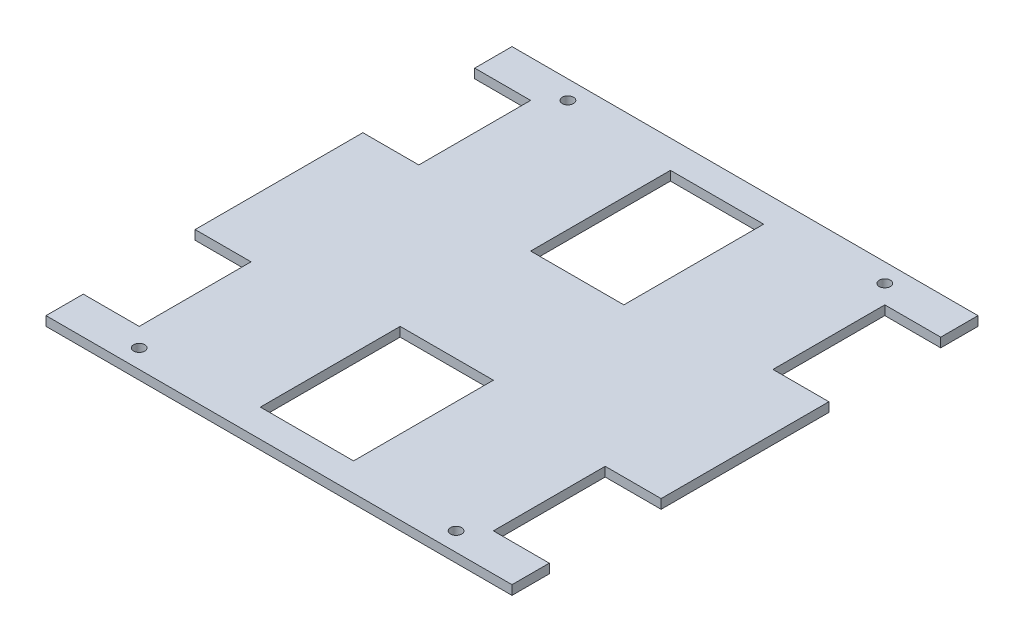
ISO-10303-21;
HEADER;
FILE_DESCRIPTION(('STEP AP214'),'2;1');
FILE_NAME('part.step','',(''),(''),'','','');
FILE_SCHEMA(('AUTOMOTIVE_DESIGN { 1 0 10303 214 1 1 1 1 }'));
ENDSEC;
DATA;
#1=APPLICATION_CONTEXT('core data for automotive mechanical design processes');
#2=APPLICATION_PROTOCOL_DEFINITION('international standard','automotive_design',2000,#1);
#3=PRODUCT_CONTEXT('',#1,'mechanical');
#4=PRODUCT('Part','Part','',(#3));
#5=PRODUCT_RELATED_PRODUCT_CATEGORY('part','',(#4));
#6=PRODUCT_DEFINITION_FORMATION('','',#4);
#7=PRODUCT_DEFINITION_CONTEXT('part definition',#1,'design');
#8=PRODUCT_DEFINITION('design','',#6,#7);
#9=PRODUCT_DEFINITION_SHAPE('','',#8);
#10=(LENGTH_UNIT() NAMED_UNIT(*) SI_UNIT(.MILLI.,.METRE.));
#11=(NAMED_UNIT(*) PLANE_ANGLE_UNIT() SI_UNIT($,.RADIAN.));
#12=(NAMED_UNIT(*) SI_UNIT($,.STERADIAN.) SOLID_ANGLE_UNIT());
#13=UNCERTAINTY_MEASURE_WITH_UNIT(LENGTH_MEASURE(1.E-05),#10,'distance_accuracy_value','');
#14=(GEOMETRIC_REPRESENTATION_CONTEXT(3) GLOBAL_UNCERTAINTY_ASSIGNED_CONTEXT((#13)) GLOBAL_UNIT_ASSIGNED_CONTEXT((#10,
#11,#12)) REPRESENTATION_CONTEXT('',''));
#15=CARTESIAN_POINT('',(0.,0.,0.));
#16=DIRECTION('',(0.,0.,1.));
#17=DIRECTION('',(1.,0.,0.));
#18=AXIS2_PLACEMENT_3D('',#15,#16,#17);
#19=CARTESIAN_POINT('',(0.,5.,-110.));
#20=DIRECTION('',(0.,0.,-1.));
#21=DIRECTION('',(-1.,0.,0.));
#22=AXIS2_PLACEMENT_3D('',#19,#20,#21);
#23=PLANE('',#22);
#24=DIRECTION('',(1.,0.,0.));
#25=VECTOR('',#24,1.);
#26=CARTESIAN_POINT('',(0.,0.,-110.));
#27=LINE('',#26,#25);
#28=CARTESIAN_POINT('',(-25.,0.,-110.));
#29=VERTEX_POINT('',#28);
#30=CARTESIAN_POINT('',(25.,0.,-110.));
#31=VERTEX_POINT('',#30);
#32=EDGE_CURVE('E327',#29,#31,#27,.T.);
#33=ORIENTED_EDGE('',*,*,#32,.T.);
#34=DIRECTION('',(0.,-1.,0.));
#35=VECTOR('',#34,1.);
#36=CARTESIAN_POINT('',(25.,5.,-110.));
#37=LINE('',#36,#35);
#38=CARTESIAN_POINT('',(25.,5.,-110.));
#39=VERTEX_POINT('',#38);
#40=EDGE_CURVE('E11',#39,#31,#37,.T.);
#41=ORIENTED_EDGE('',*,*,#40,.F.);
#42=DIRECTION('',(1.,0.,0.));
#43=VECTOR('',#42,1.);
#44=CARTESIAN_POINT('',(0.,5.,-110.));
#45=LINE('',#44,#43);
#46=CARTESIAN_POINT('',(-25.,5.,-110.));
#47=VERTEX_POINT('',#46);
#48=EDGE_CURVE('E244',#47,#39,#45,.T.);
#49=ORIENTED_EDGE('',*,*,#48,.F.);
#50=DIRECTION('',(0.,-1.,0.));
#51=VECTOR('',#50,1.);
#52=CARTESIAN_POINT('',(-25.,5.,-110.));
#53=LINE('',#52,#51);
#54=EDGE_CURVE('E347',#47,#29,#53,.T.);
#55=ORIENTED_EDGE('',*,*,#54,.T.);
#56=EDGE_LOOP('',(#33,#41,#49,#55));
#57=FACE_BOUND('',#56,.T.);
#58=ADVANCED_FACE('F37',(#57),#23,.F.);
#59=CARTESIAN_POINT('',(25.,5.,0.));
#60=DIRECTION('',(-1.,0.,0.));
#61=DIRECTION('',(0.,0.,1.));
#62=AXIS2_PLACEMENT_3D('',#59,#60,#61);
#63=PLANE('',#62);
#64=DIRECTION('',(0.,0.,-1.));
#65=VECTOR('',#64,1.);
#66=CARTESIAN_POINT('',(25.,0.,0.));
#67=LINE('',#66,#65);
#68=CARTESIAN_POINT('',(25.,0.,-35.));
#69=VERTEX_POINT('',#68);
#70=EDGE_CURVE('E234',#69,#31,#67,.T.);
#71=ORIENTED_EDGE('',*,*,#70,.F.);
#72=DIRECTION('',(0.,-1.,0.));
#73=VECTOR('',#72,1.);
#74=CARTESIAN_POINT('',(25.,5.,-35.));
#75=LINE('',#74,#73);
#76=CARTESIAN_POINT('',(25.,5.,-35.));
#77=VERTEX_POINT('',#76);
#78=EDGE_CURVE('E47',#77,#69,#75,.T.);
#79=ORIENTED_EDGE('',*,*,#78,.F.);
#80=DIRECTION('',(0.,0.,-1.));
#81=VECTOR('',#80,1.);
#82=CARTESIAN_POINT('',(25.,5.,0.));
#83=LINE('',#82,#81);
#84=EDGE_CURVE('E232',#77,#39,#83,.T.);
#85=ORIENTED_EDGE('',*,*,#84,.T.);
#86=ORIENTED_EDGE('',*,*,#40,.T.);
#87=EDGE_LOOP('',(#71,#79,#85,#86));
#88=FACE_BOUND('',#87,.T.);
#89=ADVANCED_FACE('F231',(#88),#63,.T.);
#90=CARTESIAN_POINT('',(0.,5.,-35.));
#91=DIRECTION('',(0.,0.,-1.));
#92=DIRECTION('',(-1.,0.,0.));
#93=AXIS2_PLACEMENT_3D('',#90,#91,#92);
#94=PLANE('',#93);
#95=DIRECTION('',(1.,0.,0.));
#96=VECTOR('',#95,1.);
#97=CARTESIAN_POINT('',(0.,0.,-35.));
#98=LINE('',#97,#96);
#99=CARTESIAN_POINT('',(-25.,0.,-35.));
#100=VERTEX_POINT('',#99);
#101=EDGE_CURVE('E331',#100,#69,#98,.T.);
#102=ORIENTED_EDGE('',*,*,#101,.F.);
#103=DIRECTION('',(0.,-1.,0.));
#104=VECTOR('',#103,1.);
#105=CARTESIAN_POINT('',(-25.,5.,-35.));
#106=LINE('',#105,#104);
#107=CARTESIAN_POINT('',(-25.,5.,-35.));
#108=VERTEX_POINT('',#107);
#109=EDGE_CURVE('E143',#108,#100,#106,.T.);
#110=ORIENTED_EDGE('',*,*,#109,.F.);
#111=DIRECTION('',(1.,0.,0.));
#112=VECTOR('',#111,1.);
#113=CARTESIAN_POINT('',(0.,5.,-35.));
#114=LINE('',#113,#112);
#115=EDGE_CURVE('E242',#108,#77,#114,.T.);
#116=ORIENTED_EDGE('',*,*,#115,.T.);
#117=ORIENTED_EDGE('',*,*,#78,.T.);
#118=EDGE_LOOP('',(#102,#110,#116,#117));
#119=FACE_BOUND('',#118,.T.);
#120=ADVANCED_FACE('F247',(#119),#94,.T.);
#121=CARTESIAN_POINT('',(0.,5.,125.));
#122=DIRECTION('',(0.,0.,-1.));
#123=DIRECTION('',(-1.,0.,0.));
#124=AXIS2_PLACEMENT_3D('',#121,#122,#123);
#125=PLANE('',#124);
#126=DIRECTION('',(1.,0.,0.));
#127=VECTOR('',#126,1.);
#128=CARTESIAN_POINT('',(0.,0.,125.));
#129=LINE('',#128,#127);
#130=CARTESIAN_POINT('',(-125.,0.,125.));
#131=VERTEX_POINT('',#130);
#132=CARTESIAN_POINT('',(125.,0.,125.));
#133=VERTEX_POINT('',#132);
#134=EDGE_CURVE('E277',#131,#133,#129,.T.);
#135=ORIENTED_EDGE('',*,*,#134,.T.);
#136=DIRECTION('',(0.,-1.,0.));
#137=VECTOR('',#136,1.);
#138=CARTESIAN_POINT('',(125.,5.,125.));
#139=LINE('',#138,#137);
#140=CARTESIAN_POINT('',(125.,5.,125.));
#141=VERTEX_POINT('',#140);
#142=EDGE_CURVE('E349',#141,#133,#139,.T.);
#143=ORIENTED_EDGE('',*,*,#142,.F.);
#144=DIRECTION('',(1.,0.,0.));
#145=VECTOR('',#144,1.);
#146=CARTESIAN_POINT('',(0.,5.,125.));
#147=LINE('',#146,#145);
#148=CARTESIAN_POINT('',(-125.,5.,125.));
#149=VERTEX_POINT('',#148);
#150=EDGE_CURVE('E799',#149,#141,#147,.T.);
#151=ORIENTED_EDGE('',*,*,#150,.F.);
#152=DIRECTION('',(0.,-1.,0.));
#153=VECTOR('',#152,1.);
#154=CARTESIAN_POINT('',(-125.,5.,125.));
#155=LINE('',#154,#153);
#156=EDGE_CURVE('E351',#149,#131,#155,.T.);
#157=ORIENTED_EDGE('',*,*,#156,.T.);
#158=EDGE_LOOP('',(#135,#143,#151,#157));
#159=FACE_BOUND('',#158,.T.);
#160=ADVANCED_FACE('F509',(#159),#125,.F.);
#161=CARTESIAN_POINT('',(125.,5.,0.));
#162=DIRECTION('',(-1.,0.,0.));
#163=DIRECTION('',(0.,0.,1.));
#164=AXIS2_PLACEMENT_3D('',#161,#162,#163);
#165=PLANE('',#164);
#166=DIRECTION('',(0.,0.,-1.));
#167=VECTOR('',#166,1.);
#168=CARTESIAN_POINT('',(125.,0.,0.));
#169=LINE('',#168,#167);
#170=CARTESIAN_POINT('',(125.,0.,105.));
#171=VERTEX_POINT('',#170);
#172=EDGE_CURVE('E280',#133,#171,#169,.T.);
#173=ORIENTED_EDGE('',*,*,#172,.T.);
#174=DIRECTION('',(0.,-1.,0.));
#175=VECTOR('',#174,1.);
#176=CARTESIAN_POINT('',(125.,5.,105.));
#177=LINE('',#176,#175);
#178=CARTESIAN_POINT('',(125.,5.,105.));
#179=VERTEX_POINT('',#178);
#180=EDGE_CURVE('E392',#179,#171,#177,.T.);
#181=ORIENTED_EDGE('',*,*,#180,.F.);
#182=DIRECTION('',(0.,0.,-1.));
#183=VECTOR('',#182,1.);
#184=CARTESIAN_POINT('',(125.,5.,0.));
#185=LINE('',#184,#183);
#186=EDGE_CURVE('E805',#141,#179,#185,.T.);
#187=ORIENTED_EDGE('',*,*,#186,.F.);
#188=ORIENTED_EDGE('',*,*,#142,.T.);
#189=EDGE_LOOP('',(#173,#181,#187,#188));
#190=FACE_BOUND('',#189,.T.);
#191=ADVANCED_FACE('F505',(#190),#165,.F.);
#192=CARTESIAN_POINT('',(0.,5.,105.));
#193=DIRECTION('',(0.,0.,1.));
#194=DIRECTION('',(1.,0.,0.));
#195=AXIS2_PLACEMENT_3D('',#192,#193,#194);
#196=PLANE('',#195);
#197=DIRECTION('',(-1.,0.,0.));
#198=VECTOR('',#197,1.);
#199=CARTESIAN_POINT('',(0.,0.,105.));
#200=LINE('',#199,#198);
#201=CARTESIAN_POINT('',(95.,0.,105.));
#202=VERTEX_POINT('',#201);
#203=EDGE_CURVE('E282',#171,#202,#200,.T.);
#204=ORIENTED_EDGE('',*,*,#203,.T.);
#205=DIRECTION('',(0.,-1.,0.));
#206=VECTOR('',#205,1.);
#207=CARTESIAN_POINT('',(95.,5.,105.));
#208=LINE('',#207,#206);
#209=CARTESIAN_POINT('',(95.,5.,105.));
#210=VERTEX_POINT('',#209);
#211=EDGE_CURVE('E389',#210,#202,#208,.T.);
#212=ORIENTED_EDGE('',*,*,#211,.F.);
#213=DIRECTION('',(-1.,0.,0.));
#214=VECTOR('',#213,1.);
#215=CARTESIAN_POINT('',(0.,5.,105.));
#216=LINE('',#215,#214);
#217=EDGE_CURVE('E807',#179,#210,#216,.T.);
#218=ORIENTED_EDGE('',*,*,#217,.F.);
#219=ORIENTED_EDGE('',*,*,#180,.T.);
#220=EDGE_LOOP('',(#204,#212,#218,#219));
#221=FACE_BOUND('',#220,.T.);
#222=ADVANCED_FACE('F501',(#221),#196,.F.);
#223=CARTESIAN_POINT('',(95.,5.,0.));
#224=DIRECTION('',(-1.,0.,0.));
#225=DIRECTION('',(0.,0.,1.));
#226=AXIS2_PLACEMENT_3D('',#223,#224,#225);
#227=PLANE('',#226);
#228=DIRECTION('',(0.,0.,-1.));
#229=VECTOR('',#228,1.);
#230=CARTESIAN_POINT('',(95.,0.,0.));
#231=LINE('',#230,#229);
#232=CARTESIAN_POINT('',(95.,0.,45.));
#233=VERTEX_POINT('',#232);
#234=EDGE_CURVE('E284',#202,#233,#231,.T.);
#235=ORIENTED_EDGE('',*,*,#234,.T.);
#236=DIRECTION('',(0.,-1.,0.));
#237=VECTOR('',#236,1.);
#238=CARTESIAN_POINT('',(95.,5.,45.));
#239=LINE('',#238,#237);
#240=CARTESIAN_POINT('',(95.,5.,45.));
#241=VERTEX_POINT('',#240);
#242=EDGE_CURVE('E386',#241,#233,#239,.T.);
#243=ORIENTED_EDGE('',*,*,#242,.F.);
#244=DIRECTION('',(0.,0.,-1.));
#245=VECTOR('',#244,1.);
#246=CARTESIAN_POINT('',(95.,5.,0.));
#247=LINE('',#246,#245);
#248=EDGE_CURVE('E814',#210,#241,#247,.T.);
#249=ORIENTED_EDGE('',*,*,#248,.F.);
#250=ORIENTED_EDGE('',*,*,#211,.T.);
#251=EDGE_LOOP('',(#235,#243,#249,#250));
#252=FACE_BOUND('',#251,.T.);
#253=ADVANCED_FACE('F497',(#252),#227,.F.);
#254=CARTESIAN_POINT('',(0.,5.,45.));
#255=DIRECTION('',(0.,0.,-1.));
#256=DIRECTION('',(-1.,0.,0.));
#257=AXIS2_PLACEMENT_3D('',#254,#255,#256);
#258=PLANE('',#257);
#259=DIRECTION('',(1.,0.,0.));
#260=VECTOR('',#259,1.);
#261=CARTESIAN_POINT('',(0.,0.,45.));
#262=LINE('',#261,#260);
#263=CARTESIAN_POINT('',(125.,0.,45.));
#264=VERTEX_POINT('',#263);
#265=EDGE_CURVE('E286',#233,#264,#262,.T.);
#266=ORIENTED_EDGE('',*,*,#265,.T.);
#267=DIRECTION('',(0.,-1.,0.));
#268=VECTOR('',#267,1.);
#269=CARTESIAN_POINT('',(125.,5.,45.));
#270=LINE('',#269,#268);
#271=CARTESIAN_POINT('',(125.,5.,45.));
#272=VERTEX_POINT('',#271);
#273=EDGE_CURVE('E383',#272,#264,#270,.T.);
#274=ORIENTED_EDGE('',*,*,#273,.F.);
#275=DIRECTION('',(1.,0.,0.));
#276=VECTOR('',#275,1.);
#277=CARTESIAN_POINT('',(0.,5.,45.));
#278=LINE('',#277,#276);
#279=EDGE_CURVE('E816',#241,#272,#278,.T.);
#280=ORIENTED_EDGE('',*,*,#279,.F.);
#281=ORIENTED_EDGE('',*,*,#242,.T.);
#282=EDGE_LOOP('',(#266,#274,#280,#281));
#283=FACE_BOUND('',#282,.T.);
#284=ADVANCED_FACE('F494',(#283),#258,.F.);
#285=CARTESIAN_POINT('',(125.,5.,0.));
#286=DIRECTION('',(-1.,0.,0.));
#287=DIRECTION('',(0.,0.,1.));
#288=AXIS2_PLACEMENT_3D('',#285,#286,#287);
#289=PLANE('',#288);
#290=DIRECTION('',(0.,0.,-1.));
#291=VECTOR('',#290,1.);
#292=CARTESIAN_POINT('',(125.,0.,0.));
#293=LINE('',#292,#291);
#294=CARTESIAN_POINT('',(125.,0.,-45.));
#295=VERTEX_POINT('',#294);
#296=EDGE_CURVE('E288',#264,#295,#293,.T.);
#297=ORIENTED_EDGE('',*,*,#296,.T.);
#298=DIRECTION('',(0.,-1.,0.));
#299=VECTOR('',#298,1.);
#300=CARTESIAN_POINT('',(125.,5.,-45.));
#301=LINE('',#300,#299);
#302=CARTESIAN_POINT('',(125.,5.,-45.));
#303=VERTEX_POINT('',#302);
#304=EDGE_CURVE('E381',#303,#295,#301,.T.);
#305=ORIENTED_EDGE('',*,*,#304,.F.);
#306=DIRECTION('',(0.,0.,-1.));
#307=VECTOR('',#306,1.);
#308=CARTESIAN_POINT('',(125.,5.,0.));
#309=LINE('',#308,#307);
#310=EDGE_CURVE('E818',#272,#303,#309,.T.);
#311=ORIENTED_EDGE('',*,*,#310,.F.);
#312=ORIENTED_EDGE('',*,*,#273,.T.);
#313=EDGE_LOOP('',(#297,#305,#311,#312));
#314=FACE_BOUND('',#313,.T.);
#315=ADVANCED_FACE('F482',(#314),#289,.F.);
#316=CARTESIAN_POINT('',(0.,5.,-45.));
#317=DIRECTION('',(0.,0.,-1.));
#318=DIRECTION('',(-1.,0.,0.));
#319=AXIS2_PLACEMENT_3D('',#316,#317,#318);
#320=PLANE('',#319);
#321=DIRECTION('',(1.,0.,0.));
#322=VECTOR('',#321,1.);
#323=CARTESIAN_POINT('',(0.,0.,-45.));
#324=LINE('',#323,#322);
#325=CARTESIAN_POINT('',(95.,0.,-45.));
#326=VERTEX_POINT('',#325);
#327=EDGE_CURVE('E291',#326,#295,#324,.T.);
#328=ORIENTED_EDGE('',*,*,#327,.F.);
#329=DIRECTION('',(0.,-1.,0.));
#330=VECTOR('',#329,1.);
#331=CARTESIAN_POINT('',(95.,5.,-45.));
#332=LINE('',#331,#330);
#333=CARTESIAN_POINT('',(95.,5.,-45.));
#334=VERTEX_POINT('',#333);
#335=EDGE_CURVE('E379',#334,#326,#332,.T.);
#336=ORIENTED_EDGE('',*,*,#335,.F.);
#337=DIRECTION('',(1.,0.,0.));
#338=VECTOR('',#337,1.);
#339=CARTESIAN_POINT('',(0.,5.,-45.));
#340=LINE('',#339,#338);
#341=EDGE_CURVE('E820',#334,#303,#340,.T.);
#342=ORIENTED_EDGE('',*,*,#341,.T.);
#343=ORIENTED_EDGE('',*,*,#304,.T.);
#344=EDGE_LOOP('',(#328,#336,#342,#343));
#345=FACE_BOUND('',#344,.T.);
#346=ADVANCED_FACE('F489',(#345),#320,.T.);
#347=CARTESIAN_POINT('',(95.,5.,0.));
#348=DIRECTION('',(1.,0.,0.));
#349=DIRECTION('',(0.,0.,-1.));
#350=AXIS2_PLACEMENT_3D('',#347,#348,#349);
#351=PLANE('',#350);
#352=DIRECTION('',(0.,0.,1.));
#353=VECTOR('',#352,1.);
#354=CARTESIAN_POINT('',(95.,0.,0.));
#355=LINE('',#354,#353);
#356=CARTESIAN_POINT('',(95.,0.,-105.));
#357=VERTEX_POINT('',#356);
#358=EDGE_CURVE('E295',#357,#326,#355,.T.);
#359=ORIENTED_EDGE('',*,*,#358,.F.);
#360=DIRECTION('',(0.,-1.,0.));
#361=VECTOR('',#360,1.);
#362=CARTESIAN_POINT('',(95.,5.,-105.));
#363=LINE('',#362,#361);
#364=CARTESIAN_POINT('',(95.,5.,-105.));
#365=VERTEX_POINT('',#364);
#366=EDGE_CURVE('E377',#365,#357,#363,.T.);
#367=ORIENTED_EDGE('',*,*,#366,.F.);
#368=DIRECTION('',(0.,0.,1.));
#369=VECTOR('',#368,1.);
#370=CARTESIAN_POINT('',(95.,5.,0.));
#371=LINE('',#370,#369);
#372=EDGE_CURVE('E824',#365,#334,#371,.T.);
#373=ORIENTED_EDGE('',*,*,#372,.T.);
#374=ORIENTED_EDGE('',*,*,#335,.T.);
#375=EDGE_LOOP('',(#359,#367,#373,#374));
#376=FACE_BOUND('',#375,.T.);
#377=ADVANCED_FACE('F485',(#376),#351,.T.);
#378=CARTESIAN_POINT('',(0.,5.,-105.));
#379=DIRECTION('',(0.,0.,1.));
#380=DIRECTION('',(1.,0.,0.));
#381=AXIS2_PLACEMENT_3D('',#378,#379,#380);
#382=PLANE('',#381);
#383=DIRECTION('',(-1.,0.,0.));
#384=VECTOR('',#383,1.);
#385=CARTESIAN_POINT('',(0.,0.,-105.));
#386=LINE('',#385,#384);
#387=CARTESIAN_POINT('',(125.,0.,-105.));
#388=VERTEX_POINT('',#387);
#389=EDGE_CURVE('E298',#388,#357,#386,.T.);
#390=ORIENTED_EDGE('',*,*,#389,.F.);
#391=DIRECTION('',(0.,-1.,0.));
#392=VECTOR('',#391,1.);
#393=CARTESIAN_POINT('',(125.,5.,-105.));
#394=LINE('',#393,#392);
#395=CARTESIAN_POINT('',(125.,5.,-105.));
#396=VERTEX_POINT('',#395);
#397=EDGE_CURVE('E375',#396,#388,#394,.T.);
#398=ORIENTED_EDGE('',*,*,#397,.F.);
#399=DIRECTION('',(-1.,0.,0.));
#400=VECTOR('',#399,1.);
#401=CARTESIAN_POINT('',(0.,5.,-105.));
#402=LINE('',#401,#400);
#403=EDGE_CURVE('E827',#396,#365,#402,.T.);
#404=ORIENTED_EDGE('',*,*,#403,.T.);
#405=ORIENTED_EDGE('',*,*,#366,.T.);
#406=EDGE_LOOP('',(#390,#398,#404,#405));
#407=FACE_BOUND('',#406,.T.);
#408=ADVANCED_FACE('F480',(#407),#382,.T.);
#409=CARTESIAN_POINT('',(125.,0.,-125.));
#410=VERTEX_POINT('',#409);
#411=EDGE_CURVE('E292',#388,#410,#293,.T.);
#412=ORIENTED_EDGE('',*,*,#411,.T.);
#413=DIRECTION('',(0.,-1.,0.));
#414=VECTOR('',#413,1.);
#415=CARTESIAN_POINT('',(125.,5.,-125.));
#416=LINE('',#415,#414);
#417=CARTESIAN_POINT('',(125.,5.,-125.));
#418=VERTEX_POINT('',#417);
#419=EDGE_CURVE('E373',#418,#410,#416,.T.);
#420=ORIENTED_EDGE('',*,*,#419,.F.);
#421=EDGE_CURVE('E821',#396,#418,#309,.T.);
#422=ORIENTED_EDGE('',*,*,#421,.F.);
#423=ORIENTED_EDGE('',*,*,#397,.T.);
#424=EDGE_LOOP('',(#412,#420,#422,#423));
#425=FACE_BOUND('',#424,.T.);
#426=ADVANCED_FACE('F476',(#425),#289,.F.);
#427=CARTESIAN_POINT('',(0.,5.,-125.));
#428=DIRECTION('',(0.,0.,-1.));
#429=DIRECTION('',(-1.,0.,0.));
#430=AXIS2_PLACEMENT_3D('',#427,#428,#429);
#431=PLANE('',#430);
#432=DIRECTION('',(1.,0.,0.));
#433=VECTOR('',#432,1.);
#434=CARTESIAN_POINT('',(0.,0.,-125.));
#435=LINE('',#434,#433);
#436=CARTESIAN_POINT('',(-125.,0.,-125.));
#437=VERTEX_POINT('',#436);
#438=EDGE_CURVE('E301',#437,#410,#435,.T.);
#439=ORIENTED_EDGE('',*,*,#438,.F.);
#440=DIRECTION('',(0.,-1.,0.));
#441=VECTOR('',#440,1.);
#442=CARTESIAN_POINT('',(-125.,5.,-125.));
#443=LINE('',#442,#441);
#444=CARTESIAN_POINT('',(-125.,5.,-125.));
#445=VERTEX_POINT('',#444);
#446=EDGE_CURVE('E371',#445,#437,#443,.T.);
#447=ORIENTED_EDGE('',*,*,#446,.F.);
#448=DIRECTION('',(1.,0.,0.));
#449=VECTOR('',#448,1.);
#450=CARTESIAN_POINT('',(0.,5.,-125.));
#451=LINE('',#450,#449);
#452=EDGE_CURVE('E830',#445,#418,#451,.T.);
#453=ORIENTED_EDGE('',*,*,#452,.T.);
#454=ORIENTED_EDGE('',*,*,#419,.T.);
#455=EDGE_LOOP('',(#439,#447,#453,#454));
#456=FACE_BOUND('',#455,.T.);
#457=ADVANCED_FACE('F473',(#456),#431,.T.);
#458=CARTESIAN_POINT('',(-125.,5.,0.));
#459=DIRECTION('',(-1.,0.,0.));
#460=DIRECTION('',(0.,0.,1.));
#461=AXIS2_PLACEMENT_3D('',#458,#459,#460);
#462=PLANE('',#461);
#463=DIRECTION('',(0.,0.,-1.));
#464=VECTOR('',#463,1.);
#465=CARTESIAN_POINT('',(-125.,0.,0.));
#466=LINE('',#465,#464);
#467=CARTESIAN_POINT('',(-125.,0.,-105.));
#468=VERTEX_POINT('',#467);
#469=EDGE_CURVE('E304',#468,#437,#466,.T.);
#470=ORIENTED_EDGE('',*,*,#469,.F.);
#471=DIRECTION('',(0.,-1.,0.));
#472=VECTOR('',#471,1.);
#473=CARTESIAN_POINT('',(-125.,5.,-105.));
#474=LINE('',#473,#472);
#475=CARTESIAN_POINT('',(-125.,5.,-105.));
#476=VERTEX_POINT('',#475);
#477=EDGE_CURVE('E369',#476,#468,#474,.T.);
#478=ORIENTED_EDGE('',*,*,#477,.F.);
#479=DIRECTION('',(0.,0.,-1.));
#480=VECTOR('',#479,1.);
#481=CARTESIAN_POINT('',(-125.,5.,0.));
#482=LINE('',#481,#480);
#483=EDGE_CURVE('E778',#476,#445,#482,.T.);
#484=ORIENTED_EDGE('',*,*,#483,.T.);
#485=ORIENTED_EDGE('',*,*,#446,.T.);
#486=EDGE_LOOP('',(#470,#478,#484,#485));
#487=FACE_BOUND('',#486,.T.);
#488=ADVANCED_FACE('F461',(#487),#462,.T.);
#489=CARTESIAN_POINT('',(0.,5.,-105.));
#490=DIRECTION('',(0.,0.,-1.));
#491=DIRECTION('',(-1.,0.,0.));
#492=AXIS2_PLACEMENT_3D('',#489,#490,#491);
#493=PLANE('',#492);
#494=DIRECTION('',(1.,0.,0.));
#495=VECTOR('',#494,1.);
#496=CARTESIAN_POINT('',(0.,0.,-105.));
#497=LINE('',#496,#495);
#498=CARTESIAN_POINT('',(-95.,0.,-105.));
#499=VERTEX_POINT('',#498);
#500=EDGE_CURVE('E307',#468,#499,#497,.T.);
#501=ORIENTED_EDGE('',*,*,#500,.T.);
#502=DIRECTION('',(0.,-1.,0.));
#503=VECTOR('',#502,1.);
#504=CARTESIAN_POINT('',(-95.,5.,-105.));
#505=LINE('',#504,#503);
#506=CARTESIAN_POINT('',(-95.,5.,-105.));
#507=VERTEX_POINT('',#506);
#508=EDGE_CURVE('E366',#507,#499,#505,.T.);
#509=ORIENTED_EDGE('',*,*,#508,.F.);
#510=DIRECTION('',(1.,0.,0.));
#511=VECTOR('',#510,1.);
#512=CARTESIAN_POINT('',(0.,5.,-105.));
#513=LINE('',#512,#511);
#514=EDGE_CURVE('E774',#476,#507,#513,.T.);
#515=ORIENTED_EDGE('',*,*,#514,.F.);
#516=ORIENTED_EDGE('',*,*,#477,.T.);
#517=EDGE_LOOP('',(#501,#509,#515,#516));
#518=FACE_BOUND('',#517,.T.);
#519=ADVANCED_FACE('F468',(#518),#493,.F.);
#520=CARTESIAN_POINT('',(-95.,5.,0.));
#521=DIRECTION('',(1.,0.,0.));
#522=DIRECTION('',(0.,0.,-1.));
#523=AXIS2_PLACEMENT_3D('',#520,#521,#522);
#524=PLANE('',#523);
#525=DIRECTION('',(0.,0.,1.));
#526=VECTOR('',#525,1.);
#527=CARTESIAN_POINT('',(-95.,0.,0.));
#528=LINE('',#527,#526);
#529=CARTESIAN_POINT('',(-95.,0.,-45.));
#530=VERTEX_POINT('',#529);
#531=EDGE_CURVE('E310',#499,#530,#528,.T.);
#532=ORIENTED_EDGE('',*,*,#531,.T.);
#533=DIRECTION('',(0.,-1.,0.));
#534=VECTOR('',#533,1.);
#535=CARTESIAN_POINT('',(-95.,5.,-45.));
#536=LINE('',#535,#534);
#537=CARTESIAN_POINT('',(-95.,5.,-45.));
#538=VERTEX_POINT('',#537);
#539=EDGE_CURVE('E363',#538,#530,#536,.T.);
#540=ORIENTED_EDGE('',*,*,#539,.F.);
#541=DIRECTION('',(0.,0.,1.));
#542=VECTOR('',#541,1.);
#543=CARTESIAN_POINT('',(-95.,5.,0.));
#544=LINE('',#543,#542);
#545=EDGE_CURVE('E770',#507,#538,#544,.T.);
#546=ORIENTED_EDGE('',*,*,#545,.F.);
#547=ORIENTED_EDGE('',*,*,#508,.T.);
#548=EDGE_LOOP('',(#532,#540,#546,#547));
#549=FACE_BOUND('',#548,.T.);
#550=ADVANCED_FACE('F464',(#549),#524,.F.);
#551=CARTESIAN_POINT('',(0.,5.,-45.));
#552=DIRECTION('',(0.,0.,1.));
#553=DIRECTION('',(1.,0.,0.));
#554=AXIS2_PLACEMENT_3D('',#551,#552,#553);
#555=PLANE('',#554);
#556=DIRECTION('',(-1.,0.,0.));
#557=VECTOR('',#556,1.);
#558=CARTESIAN_POINT('',(0.,0.,-45.));
#559=LINE('',#558,#557);
#560=CARTESIAN_POINT('',(-125.,0.,-45.));
#561=VERTEX_POINT('',#560);
#562=EDGE_CURVE('E312',#530,#561,#559,.T.);
#563=ORIENTED_EDGE('',*,*,#562,.T.);
#564=DIRECTION('',(0.,-1.,0.));
#565=VECTOR('',#564,1.);
#566=CARTESIAN_POINT('',(-125.,5.,-45.));
#567=LINE('',#566,#565);
#568=CARTESIAN_POINT('',(-125.,5.,-45.));
#569=VERTEX_POINT('',#568);
#570=EDGE_CURVE('E361',#569,#561,#567,.T.);
#571=ORIENTED_EDGE('',*,*,#570,.F.);
#572=DIRECTION('',(-1.,0.,0.));
#573=VECTOR('',#572,1.);
#574=CARTESIAN_POINT('',(0.,5.,-45.));
#575=LINE('',#574,#573);
#576=EDGE_CURVE('E773',#538,#569,#575,.T.);
#577=ORIENTED_EDGE('',*,*,#576,.F.);
#578=ORIENTED_EDGE('',*,*,#539,.T.);
#579=EDGE_LOOP('',(#563,#571,#577,#578));
#580=FACE_BOUND('',#579,.T.);
#581=ADVANCED_FACE('F459',(#580),#555,.F.);
#582=CARTESIAN_POINT('',(-125.,0.,45.));
#583=VERTEX_POINT('',#582);
#584=EDGE_CURVE('E308',#583,#561,#466,.T.);
#585=ORIENTED_EDGE('',*,*,#584,.F.);
#586=DIRECTION('',(0.,-1.,0.));
#587=VECTOR('',#586,1.);
#588=CARTESIAN_POINT('',(-125.,5.,45.));
#589=LINE('',#588,#587);
#590=CARTESIAN_POINT('',(-125.,5.,45.));
#591=VERTEX_POINT('',#590);
#592=EDGE_CURVE('E359',#591,#583,#589,.T.);
#593=ORIENTED_EDGE('',*,*,#592,.F.);
#594=EDGE_CURVE('E776',#591,#569,#482,.T.);
#595=ORIENTED_EDGE('',*,*,#594,.T.);
#596=ORIENTED_EDGE('',*,*,#570,.T.);
#597=EDGE_LOOP('',(#585,#593,#595,#596));
#598=FACE_BOUND('',#597,.T.);
#599=ADVANCED_FACE('F455',(#598),#462,.T.);
#600=CARTESIAN_POINT('',(0.,5.,45.));
#601=DIRECTION('',(0.,0.,1.));
#602=DIRECTION('',(1.,0.,0.));
#603=AXIS2_PLACEMENT_3D('',#600,#601,#602);
#604=PLANE('',#603);
#605=DIRECTION('',(-1.,0.,0.));
#606=VECTOR('',#605,1.);
#607=CARTESIAN_POINT('',(0.,0.,45.));
#608=LINE('',#607,#606);
#609=CARTESIAN_POINT('',(-95.,0.,45.));
#610=VERTEX_POINT('',#609);
#611=EDGE_CURVE('E315',#610,#583,#608,.T.);
#612=ORIENTED_EDGE('',*,*,#611,.F.);
#613=DIRECTION('',(0.,-1.,0.));
#614=VECTOR('',#613,1.);
#615=CARTESIAN_POINT('',(-95.,5.,45.));
#616=LINE('',#615,#614);
#617=CARTESIAN_POINT('',(-95.,5.,45.));
#618=VERTEX_POINT('',#617);
#619=EDGE_CURVE('E357',#618,#610,#616,.T.);
#620=ORIENTED_EDGE('',*,*,#619,.F.);
#621=DIRECTION('',(-1.,0.,0.));
#622=VECTOR('',#621,1.);
#623=CARTESIAN_POINT('',(0.,5.,45.));
#624=LINE('',#623,#622);
#625=EDGE_CURVE('E782',#618,#591,#624,.T.);
#626=ORIENTED_EDGE('',*,*,#625,.T.);
#627=ORIENTED_EDGE('',*,*,#592,.T.);
#628=EDGE_LOOP('',(#612,#620,#626,#627));
#629=FACE_BOUND('',#628,.T.);
#630=ADVANCED_FACE('F451',(#629),#604,.T.);
#631=CARTESIAN_POINT('',(-95.,5.,0.));
#632=DIRECTION('',(-1.,0.,0.));
#633=DIRECTION('',(0.,0.,1.));
#634=AXIS2_PLACEMENT_3D('',#631,#632,#633);
#635=PLANE('',#634);
#636=DIRECTION('',(0.,0.,-1.));
#637=VECTOR('',#636,1.);
#638=CARTESIAN_POINT('',(-95.,0.,0.));
#639=LINE('',#638,#637);
#640=CARTESIAN_POINT('',(-94.9999999999999,0.,105.));
#641=VERTEX_POINT('',#640);
#642=EDGE_CURVE('E318',#641,#610,#639,.T.);
#643=ORIENTED_EDGE('',*,*,#642,.F.);
#644=DIRECTION('',(0.,-1.,0.));
#645=VECTOR('',#644,1.);
#646=CARTESIAN_POINT('',(-94.9999999999999,5.,105.));
#647=LINE('',#646,#645);
#648=CARTESIAN_POINT('',(-94.9999999999999,5.,105.));
#649=VERTEX_POINT('',#648);
#650=EDGE_CURVE('E355',#649,#641,#647,.T.);
#651=ORIENTED_EDGE('',*,*,#650,.F.);
#652=DIRECTION('',(0.,0.,-1.));
#653=VECTOR('',#652,1.);
#654=CARTESIAN_POINT('',(-95.,5.,0.));
#655=LINE('',#654,#653);
#656=EDGE_CURVE('E785',#649,#618,#655,.T.);
#657=ORIENTED_EDGE('',*,*,#656,.T.);
#658=ORIENTED_EDGE('',*,*,#619,.T.);
#659=EDGE_LOOP('',(#643,#651,#657,#658));
#660=FACE_BOUND('',#659,.T.);
#661=ADVANCED_FACE('F447',(#660),#635,.T.);
#662=CARTESIAN_POINT('',(0.,5.,105.));
#663=DIRECTION('',(0.,0.,-1.));
#664=DIRECTION('',(-1.,0.,0.));
#665=AXIS2_PLACEMENT_3D('',#662,#663,#664);
#666=PLANE('',#665);
#667=DIRECTION('',(1.,0.,0.));
#668=VECTOR('',#667,1.);
#669=CARTESIAN_POINT('',(0.,0.,105.));
#670=LINE('',#669,#668);
#671=CARTESIAN_POINT('',(-125.,0.,105.));
#672=VERTEX_POINT('',#671);
#673=EDGE_CURVE('E321',#672,#641,#670,.T.);
#674=ORIENTED_EDGE('',*,*,#673,.F.);
#675=DIRECTION('',(0.,-1.,0.));
#676=VECTOR('',#675,1.);
#677=CARTESIAN_POINT('',(-125.,5.,105.));
#678=LINE('',#677,#676);
#679=CARTESIAN_POINT('',(-125.,5.,105.));
#680=VERTEX_POINT('',#679);
#681=EDGE_CURVE('E353',#680,#672,#678,.T.);
#682=ORIENTED_EDGE('',*,*,#681,.F.);
#683=DIRECTION('',(1.,0.,0.));
#684=VECTOR('',#683,1.);
#685=CARTESIAN_POINT('',(0.,5.,105.));
#686=LINE('',#685,#684);
#687=EDGE_CURVE('E788',#680,#649,#686,.T.);
#688=ORIENTED_EDGE('',*,*,#687,.T.);
#689=ORIENTED_EDGE('',*,*,#650,.T.);
#690=EDGE_LOOP('',(#674,#682,#688,#689));
#691=FACE_BOUND('',#690,.T.);
#692=ADVANCED_FACE('F444',(#691),#666,.T.);
#693=CARTESIAN_POINT('',(0.,5.,35.));
#694=DIRECTION('',(0.,0.,-1.));
#695=DIRECTION('',(-1.,0.,0.));
#696=AXIS2_PLACEMENT_3D('',#693,#694,#695);
#697=PLANE('',#696);
#698=DIRECTION('',(1.,0.,0.));
#699=VECTOR('',#698,1.);
#700=CARTESIAN_POINT('',(0.,0.,35.));
#701=LINE('',#700,#699);
#702=CARTESIAN_POINT('',(-25.,0.,35.));
#703=VERTEX_POINT('',#702);
#704=CARTESIAN_POINT('',(25.,0.,35.));
#705=VERTEX_POINT('',#704);
#706=EDGE_CURVE('E265',#703,#705,#701,.T.);
#707=ORIENTED_EDGE('',*,*,#706,.T.);
#708=DIRECTION('',(0.,-1.,0.));
#709=VECTOR('',#708,1.);
#710=CARTESIAN_POINT('',(25.,5.,35.));
#711=LINE('',#710,#709);
#712=CARTESIAN_POINT('',(25.,5.,35.));
#713=VERTEX_POINT('',#712);
#714=EDGE_CURVE('E41',#713,#705,#711,.T.);
#715=ORIENTED_EDGE('',*,*,#714,.F.);
#716=DIRECTION('',(1.,0.,0.));
#717=VECTOR('',#716,1.);
#718=CARTESIAN_POINT('',(0.,5.,35.));
#719=LINE('',#718,#717);
#720=CARTESIAN_POINT('',(-25.,5.,35.));
#721=VERTEX_POINT('',#720);
#722=EDGE_CURVE('E346',#721,#713,#719,.T.);
#723=ORIENTED_EDGE('',*,*,#722,.F.);
#724=DIRECTION('',(0.,-1.,0.));
#725=VECTOR('',#724,1.);
#726=CARTESIAN_POINT('',(-25.,5.,35.));
#727=LINE('',#726,#725);
#728=EDGE_CURVE('E264',#721,#703,#727,.T.);
#729=ORIENTED_EDGE('',*,*,#728,.T.);
#730=EDGE_LOOP('',(#707,#715,#723,#729));
#731=FACE_BOUND('',#730,.T.);
#732=ADVANCED_FACE('F39',(#731),#697,.F.);
#733=CARTESIAN_POINT('',(25.,5.,0.));
#734=DIRECTION('',(1.,0.,0.));
#735=DIRECTION('',(0.,0.,-1.));
#736=AXIS2_PLACEMENT_3D('',#733,#734,#735);
#737=PLANE('',#736);
#738=DIRECTION('',(0.,0.,1.));
#739=VECTOR('',#738,1.);
#740=CARTESIAN_POINT('',(25.,0.,0.));
#741=LINE('',#740,#739);
#742=CARTESIAN_POINT('',(25.,0.,110.));
#743=VERTEX_POINT('',#742);
#744=EDGE_CURVE('E268',#705,#743,#741,.T.);
#745=ORIENTED_EDGE('',*,*,#744,.T.);
#746=DIRECTION('',(0.,-1.,0.));
#747=VECTOR('',#746,1.);
#748=CARTESIAN_POINT('',(25.,5.,110.));
#749=LINE('',#748,#747);
#750=CARTESIAN_POINT('',(25.,5.,110.));
#751=VERTEX_POINT('',#750);
#752=EDGE_CURVE('E399',#751,#743,#749,.T.);
#753=ORIENTED_EDGE('',*,*,#752,.F.);
#754=DIRECTION('',(0.,0.,1.));
#755=VECTOR('',#754,1.);
#756=CARTESIAN_POINT('',(25.,5.,0.));
#757=LINE('',#756,#755);
#758=EDGE_CURVE('E155',#713,#751,#757,.T.);
#759=ORIENTED_EDGE('',*,*,#758,.F.);
#760=ORIENTED_EDGE('',*,*,#714,.T.);
#761=EDGE_LOOP('',(#745,#753,#759,#760));
#762=FACE_BOUND('',#761,.T.);
#763=ADVANCED_FACE('F404',(#762),#737,.F.);
#764=CARTESIAN_POINT('',(0.,5.,110.));
#765=DIRECTION('',(0.,0.,-1.));
#766=DIRECTION('',(-1.,0.,0.));
#767=AXIS2_PLACEMENT_3D('',#764,#765,#766);
#768=PLANE('',#767);
#769=DIRECTION('',(1.,0.,0.));
#770=VECTOR('',#769,1.);
#771=CARTESIAN_POINT('',(0.,0.,110.));
#772=LINE('',#771,#770);
#773=CARTESIAN_POINT('',(-25.,0.,110.));
#774=VERTEX_POINT('',#773);
#775=EDGE_CURVE('E271',#774,#743,#772,.T.);
#776=ORIENTED_EDGE('',*,*,#775,.F.);
#777=DIRECTION('',(0.,-1.,0.));
#778=VECTOR('',#777,1.);
#779=CARTESIAN_POINT('',(-25.,5.,110.));
#780=LINE('',#779,#778);
#781=CARTESIAN_POINT('',(-25.,5.,110.));
#782=VERTEX_POINT('',#781);
#783=EDGE_CURVE('E398',#782,#774,#780,.T.);
#784=ORIENTED_EDGE('',*,*,#783,.F.);
#785=DIRECTION('',(1.,0.,0.));
#786=VECTOR('',#785,1.);
#787=CARTESIAN_POINT('',(0.,5.,110.));
#788=LINE('',#787,#786);
#789=EDGE_CURVE('E809',#782,#751,#788,.T.);
#790=ORIENTED_EDGE('',*,*,#789,.T.);
#791=ORIENTED_EDGE('',*,*,#752,.T.);
#792=EDGE_LOOP('',(#776,#784,#790,#791));
#793=FACE_BOUND('',#792,.T.);
#794=ADVANCED_FACE('F418',(#793),#768,.T.);
#795=CARTESIAN_POINT('',(-85.,5.,115.));
#796=DIRECTION('',(0.,-1.,0.));
#797=DIRECTION('',(0.,0.,-1.));
#798=AXIS2_PLACEMENT_3D('',#795,#796,#797);
#799=CYLINDRICAL_SURFACE('',#798,3.00000000000001);
#800=CARTESIAN_POINT('',(-85.,5.,115.));
#801=DIRECTION('',(0.,1.,0.));
#802=DIRECTION('',(0.,0.,1.));
#803=AXIS2_PLACEMENT_3D('',#800,#801,#802);
#804=CIRCLE('',#803,3.00000000000001);
#805=CARTESIAN_POINT('',(-85.,5.,118.));
#806=VERTEX_POINT('',#805);
#807=EDGE_CURVE('E258',#806,#806,#804,.F.);
#808=ORIENTED_EDGE('',*,*,#807,.F.);
#809=EDGE_LOOP('',(#808));
#810=FACE_BOUND('',#809,.T.);
#811=CARTESIAN_POINT('',(-85.,0.,115.));
#812=DIRECTION('',(0.,1.,0.));
#813=DIRECTION('',(0.,0.,1.));
#814=AXIS2_PLACEMENT_3D('',#811,#812,#813);
#815=CIRCLE('',#814,3.00000000000001);
#816=CARTESIAN_POINT('',(-85.,0.,118.));
#817=VERTEX_POINT('',#816);
#818=EDGE_CURVE('E340',#817,#817,#815,.F.);
#819=ORIENTED_EDGE('',*,*,#818,.T.);
#820=EDGE_LOOP('',(#819));
#821=FACE_BOUND('',#820,.T.);
#822=ADVANCED_FACE('F420',(#810,#821),#799,.F.);
#823=CARTESIAN_POINT('',(85.,5.,-115.));
#824=DIRECTION('',(0.,-1.,0.));
#825=DIRECTION('',(0.,0.,-1.));
#826=AXIS2_PLACEMENT_3D('',#823,#824,#825);
#827=CYLINDRICAL_SURFACE('',#826,3.00000000000001);
#828=CARTESIAN_POINT('',(85.,5.,-115.));
#829=DIRECTION('',(0.,1.,0.));
#830=DIRECTION('',(0.,0.,1.));
#831=AXIS2_PLACEMENT_3D('',#828,#829,#830);
#832=CIRCLE('',#831,3.00000000000001);
#833=CARTESIAN_POINT('',(85.,5.,-112.));
#834=VERTEX_POINT('',#833);
#835=EDGE_CURVE('E255',#834,#834,#832,.F.);
#836=ORIENTED_EDGE('',*,*,#835,.F.);
#837=EDGE_LOOP('',(#836));
#838=FACE_BOUND('',#837,.T.);
#839=CARTESIAN_POINT('',(85.,0.,-115.));
#840=DIRECTION('',(0.,1.,0.));
#841=DIRECTION('',(0.,0.,1.));
#842=AXIS2_PLACEMENT_3D('',#839,#840,#841);
#843=CIRCLE('',#842,3.00000000000001);
#844=CARTESIAN_POINT('',(85.,0.,-112.));
#845=VERTEX_POINT('',#844);
#846=EDGE_CURVE('E337',#845,#845,#843,.F.);
#847=ORIENTED_EDGE('',*,*,#846,.T.);
#848=EDGE_LOOP('',(#847));
#849=FACE_BOUND('',#848,.T.);
#850=ADVANCED_FACE('F426',(#838,#849),#827,.F.);
#851=CARTESIAN_POINT('',(-85.,5.,-115.));
#852=DIRECTION('',(0.,-1.,0.));
#853=DIRECTION('',(0.,0.,-1.));
#854=AXIS2_PLACEMENT_3D('',#851,#852,#853);
#855=CYLINDRICAL_SURFACE('',#854,3.00000000000001);
#856=CARTESIAN_POINT('',(-85.,5.,-115.));
#857=DIRECTION('',(0.,1.,0.));
#858=DIRECTION('',(0.,0.,1.));
#859=AXIS2_PLACEMENT_3D('',#856,#857,#858);
#860=CIRCLE('',#859,3.00000000000001);
#861=CARTESIAN_POINT('',(-85.,5.,-112.));
#862=VERTEX_POINT('',#861);
#863=EDGE_CURVE('E249',#862,#862,#860,.T.);
#864=ORIENTED_EDGE('',*,*,#863,.T.);
#865=EDGE_LOOP('',(#864));
#866=FACE_BOUND('',#865,.T.);
#867=CARTESIAN_POINT('',(-85.,0.,-115.));
#868=DIRECTION('',(0.,1.,0.));
#869=DIRECTION('',(0.,0.,1.));
#870=AXIS2_PLACEMENT_3D('',#867,#868,#869);
#871=CIRCLE('',#870,3.00000000000001);
#872=CARTESIAN_POINT('',(-85.,0.,-112.));
#873=VERTEX_POINT('',#872);
#874=EDGE_CURVE('E334',#873,#873,#871,.T.);
#875=ORIENTED_EDGE('',*,*,#874,.F.);
#876=EDGE_LOOP('',(#875));
#877=FACE_BOUND('',#876,.T.);
#878=ADVANCED_FACE('F530',(#866,#877),#855,.F.);
#879=CARTESIAN_POINT('',(-25.,5.,0.));
#880=DIRECTION('',(-1.,0.,0.));
#881=DIRECTION('',(0.,0.,1.));
#882=AXIS2_PLACEMENT_3D('',#879,#880,#881);
#883=PLANE('',#882);
#884=DIRECTION('',(0.,0.,-1.));
#885=VECTOR('',#884,1.);
#886=CARTESIAN_POINT('',(-25.,0.,0.));
#887=LINE('',#886,#885);
#888=EDGE_CURVE('E146',#100,#29,#887,.T.);
#889=ORIENTED_EDGE('',*,*,#888,.T.);
#890=ORIENTED_EDGE('',*,*,#54,.F.);
#891=DIRECTION('',(0.,0.,-1.));
#892=VECTOR('',#891,1.);
#893=CARTESIAN_POINT('',(-25.,5.,0.));
#894=LINE('',#893,#892);
#895=EDGE_CURVE('E56',#108,#47,#894,.T.);
#896=ORIENTED_EDGE('',*,*,#895,.F.);
#897=ORIENTED_EDGE('',*,*,#109,.T.);
#898=EDGE_LOOP('',(#889,#890,#896,#897));
#899=FACE_BOUND('',#898,.T.);
#900=ADVANCED_FACE('F442',(#899),#883,.F.);
#901=CARTESIAN_POINT('',(-125.,5.,0.));
#902=DIRECTION('',(-1.,0.,0.));
#903=DIRECTION('',(0.,0.,1.));
#904=AXIS2_PLACEMENT_3D('',#901,#902,#903);
#905=PLANE('',#904);
#906=DIRECTION('',(0.,0.,-1.));
#907=VECTOR('',#906,1.);
#908=CARTESIAN_POINT('',(-125.,0.,0.));
#909=LINE('',#908,#907);
#910=EDGE_CURVE('E324',#131,#672,#909,.T.);
#911=ORIENTED_EDGE('',*,*,#910,.F.);
#912=ORIENTED_EDGE('',*,*,#156,.F.);
#913=DIRECTION('',(0.,0.,-1.));
#914=VECTOR('',#913,1.);
#915=CARTESIAN_POINT('',(-125.,5.,0.));
#916=LINE('',#915,#914);
#917=EDGE_CURVE('E791',#149,#680,#916,.T.);
#918=ORIENTED_EDGE('',*,*,#917,.T.);
#919=ORIENTED_EDGE('',*,*,#681,.T.);
#920=EDGE_LOOP('',(#911,#912,#918,#919));
#921=FACE_BOUND('',#920,.T.);
#922=ADVANCED_FACE('F439',(#921),#905,.T.);
#923=CARTESIAN_POINT('',(-25.,5.,0.));
#924=DIRECTION('',(1.,0.,0.));
#925=DIRECTION('',(0.,0.,-1.));
#926=AXIS2_PLACEMENT_3D('',#923,#924,#925);
#927=PLANE('',#926);
#928=DIRECTION('',(0.,0.,1.));
#929=VECTOR('',#928,1.);
#930=CARTESIAN_POINT('',(-25.,0.,0.));
#931=LINE('',#930,#929);
#932=EDGE_CURVE('E274',#703,#774,#931,.T.);
#933=ORIENTED_EDGE('',*,*,#932,.F.);
#934=ORIENTED_EDGE('',*,*,#728,.F.);
#935=DIRECTION('',(0.,0.,1.));
#936=VECTOR('',#935,1.);
#937=CARTESIAN_POINT('',(-25.,5.,0.));
#938=LINE('',#937,#936);
#939=EDGE_CURVE('E416',#721,#782,#938,.T.);
#940=ORIENTED_EDGE('',*,*,#939,.T.);
#941=ORIENTED_EDGE('',*,*,#783,.T.);
#942=EDGE_LOOP('',(#933,#934,#940,#941));
#943=FACE_BOUND('',#942,.T.);
#944=ADVANCED_FACE('F413',(#943),#927,.T.);
#945=CARTESIAN_POINT('',(85.,5.,115.));
#946=DIRECTION('',(0.,-1.,0.));
#947=DIRECTION('',(0.,0.,-1.));
#948=AXIS2_PLACEMENT_3D('',#945,#946,#947);
#949=CYLINDRICAL_SURFACE('',#948,3.00000000000001);
#950=CARTESIAN_POINT('',(85.,5.,115.));
#951=DIRECTION('',(0.,1.,0.));
#952=DIRECTION('',(0.,0.,1.));
#953=AXIS2_PLACEMENT_3D('',#950,#951,#952);
#954=CIRCLE('',#953,3.00000000000001);
#955=CARTESIAN_POINT('',(85.,5.,118.));
#956=VERTEX_POINT('',#955);
#957=EDGE_CURVE('E261',#956,#956,#954,.T.);
#958=ORIENTED_EDGE('',*,*,#957,.T.);
#959=EDGE_LOOP('',(#958));
#960=FACE_BOUND('',#959,.T.);
#961=CARTESIAN_POINT('',(85.,0.,115.));
#962=DIRECTION('',(0.,1.,0.));
#963=DIRECTION('',(0.,0.,1.));
#964=AXIS2_PLACEMENT_3D('',#961,#962,#963);
#965=CIRCLE('',#964,3.00000000000001);
#966=CARTESIAN_POINT('',(85.,0.,118.));
#967=VERTEX_POINT('',#966);
#968=EDGE_CURVE('E343',#967,#967,#965,.T.);
#969=ORIENTED_EDGE('',*,*,#968,.F.);
#970=EDGE_LOOP('',(#969));
#971=FACE_BOUND('',#970,.T.);
#972=ADVANCED_FACE('F514',(#960,#971),#949,.F.);
#973=CARTESIAN_POINT('',(0.,5.,0.));
#974=DIRECTION('',(0.,1.,0.));
#975=DIRECTION('',(0.,0.,1.));
#976=AXIS2_PLACEMENT_3D('',#973,#974,#975);
#977=PLANE('',#976);
#978=ORIENTED_EDGE('',*,*,#722,.T.);
#979=ORIENTED_EDGE('',*,*,#758,.T.);
#980=ORIENTED_EDGE('',*,*,#789,.F.);
#981=ORIENTED_EDGE('',*,*,#939,.F.);
#982=EDGE_LOOP('',(#978,#979,#980,#981));
#983=FACE_BOUND('',#982,.T.);
#984=ORIENTED_EDGE('',*,*,#150,.T.);
#985=ORIENTED_EDGE('',*,*,#186,.T.);
#986=ORIENTED_EDGE('',*,*,#217,.T.);
#987=ORIENTED_EDGE('',*,*,#248,.T.);
#988=ORIENTED_EDGE('',*,*,#279,.T.);
#989=ORIENTED_EDGE('',*,*,#310,.T.);
#990=ORIENTED_EDGE('',*,*,#341,.F.);
#991=ORIENTED_EDGE('',*,*,#372,.F.);
#992=ORIENTED_EDGE('',*,*,#403,.F.);
#993=ORIENTED_EDGE('',*,*,#421,.T.);
#994=ORIENTED_EDGE('',*,*,#452,.F.);
#995=ORIENTED_EDGE('',*,*,#483,.F.);
#996=ORIENTED_EDGE('',*,*,#514,.T.);
#997=ORIENTED_EDGE('',*,*,#545,.T.);
#998=ORIENTED_EDGE('',*,*,#576,.T.);
#999=ORIENTED_EDGE('',*,*,#594,.F.);
#1000=ORIENTED_EDGE('',*,*,#625,.F.);
#1001=ORIENTED_EDGE('',*,*,#656,.F.);
#1002=ORIENTED_EDGE('',*,*,#687,.F.);
#1003=ORIENTED_EDGE('',*,*,#917,.F.);
#1004=EDGE_LOOP('',(#984,#985,#986,#987,#988,#989,#990,#991,#992,#993,#994,#995,#996,#997,#998,
#999,#1000,#1001,#1002,#1003));
#1005=FACE_BOUND('',#1004,.T.);
#1006=ORIENTED_EDGE('',*,*,#48,.T.);
#1007=ORIENTED_EDGE('',*,*,#84,.F.);
#1008=ORIENTED_EDGE('',*,*,#115,.F.);
#1009=ORIENTED_EDGE('',*,*,#895,.T.);
#1010=EDGE_LOOP('',(#1006,#1007,#1008,#1009));
#1011=FACE_BOUND('',#1010,.T.);
#1012=ORIENTED_EDGE('',*,*,#863,.F.);
#1013=EDGE_LOOP('',(#1012));
#1014=FACE_BOUND('',#1013,.T.);
#1015=ORIENTED_EDGE('',*,*,#835,.T.);
#1016=EDGE_LOOP('',(#1015));
#1017=FACE_BOUND('',#1016,.T.);
#1018=ORIENTED_EDGE('',*,*,#807,.T.);
#1019=EDGE_LOOP('',(#1018));
#1020=FACE_BOUND('',#1019,.T.);
#1021=ORIENTED_EDGE('',*,*,#957,.F.);
#1022=EDGE_LOOP('',(#1021));
#1023=FACE_BOUND('',#1022,.T.);
#1024=ADVANCED_FACE('F240',(#983,#1005,#1011,#1014,#1017,#1020,#1023),#977,.T.);
#1025=CARTESIAN_POINT('',(0.,0.,0.));
#1026=DIRECTION('',(0.,1.,0.));
#1027=DIRECTION('',(0.,0.,1.));
#1028=AXIS2_PLACEMENT_3D('',#1025,#1026,#1027);
#1029=PLANE('',#1028);
#1030=ORIENTED_EDGE('',*,*,#706,.F.);
#1031=ORIENTED_EDGE('',*,*,#932,.T.);
#1032=ORIENTED_EDGE('',*,*,#775,.T.);
#1033=ORIENTED_EDGE('',*,*,#744,.F.);
#1034=EDGE_LOOP('',(#1030,#1031,#1032,#1033));
#1035=FACE_BOUND('',#1034,.T.);
#1036=ORIENTED_EDGE('',*,*,#134,.F.);
#1037=ORIENTED_EDGE('',*,*,#910,.T.);
#1038=ORIENTED_EDGE('',*,*,#673,.T.);
#1039=ORIENTED_EDGE('',*,*,#642,.T.);
#1040=ORIENTED_EDGE('',*,*,#611,.T.);
#1041=ORIENTED_EDGE('',*,*,#584,.T.);
#1042=ORIENTED_EDGE('',*,*,#562,.F.);
#1043=ORIENTED_EDGE('',*,*,#531,.F.);
#1044=ORIENTED_EDGE('',*,*,#500,.F.);
#1045=ORIENTED_EDGE('',*,*,#469,.T.);
#1046=ORIENTED_EDGE('',*,*,#438,.T.);
#1047=ORIENTED_EDGE('',*,*,#411,.F.);
#1048=ORIENTED_EDGE('',*,*,#389,.T.);
#1049=ORIENTED_EDGE('',*,*,#358,.T.);
#1050=ORIENTED_EDGE('',*,*,#327,.T.);
#1051=ORIENTED_EDGE('',*,*,#296,.F.);
#1052=ORIENTED_EDGE('',*,*,#265,.F.);
#1053=ORIENTED_EDGE('',*,*,#234,.F.);
#1054=ORIENTED_EDGE('',*,*,#203,.F.);
#1055=ORIENTED_EDGE('',*,*,#172,.F.);
#1056=EDGE_LOOP('',(#1036,#1037,#1038,#1039,#1040,#1041,#1042,#1043,#1044,#1045,#1046,#1047,
#1048,#1049,#1050,#1051,#1052,#1053,#1054,#1055));
#1057=FACE_BOUND('',#1056,.T.);
#1058=ORIENTED_EDGE('',*,*,#32,.F.);
#1059=ORIENTED_EDGE('',*,*,#888,.F.);
#1060=ORIENTED_EDGE('',*,*,#101,.T.);
#1061=ORIENTED_EDGE('',*,*,#70,.T.);
#1062=EDGE_LOOP('',(#1058,#1059,#1060,#1061));
#1063=FACE_BOUND('',#1062,.T.);
#1064=ORIENTED_EDGE('',*,*,#874,.T.);
#1065=EDGE_LOOP('',(#1064));
#1066=FACE_BOUND('',#1065,.T.);
#1067=ORIENTED_EDGE('',*,*,#846,.F.);
#1068=EDGE_LOOP('',(#1067));
#1069=FACE_BOUND('',#1068,.T.);
#1070=ORIENTED_EDGE('',*,*,#818,.F.);
#1071=EDGE_LOOP('',(#1070));
#1072=FACE_BOUND('',#1071,.T.);
#1073=ORIENTED_EDGE('',*,*,#968,.T.);
#1074=EDGE_LOOP('',(#1073));
#1075=FACE_BOUND('',#1074,.T.);
#1076=ADVANCED_FACE('F410',(#1035,#1057,#1063,#1066,#1069,#1072,#1075),#1029,.F.);
#1077=CLOSED_SHELL('',(#58,#89,#120,#160,#191,#222,#253,#284,#315,#346,#377,#408,#426,#457,#488,
#519,#550,#581,#599,#630,#661,#692,#732,#763,#794,#822,#850,#878,#900,#922,#944,#972,#1024,#1076));
#1078=MANIFOLD_SOLID_BREP('B2',#1077);
#1079=ADVANCED_BREP_SHAPE_REPRESENTATION('',(#18,#1078),#14);
#1080=SHAPE_DEFINITION_REPRESENTATION(#9,#1079);
ENDSEC;
END-ISO-10303-21;
